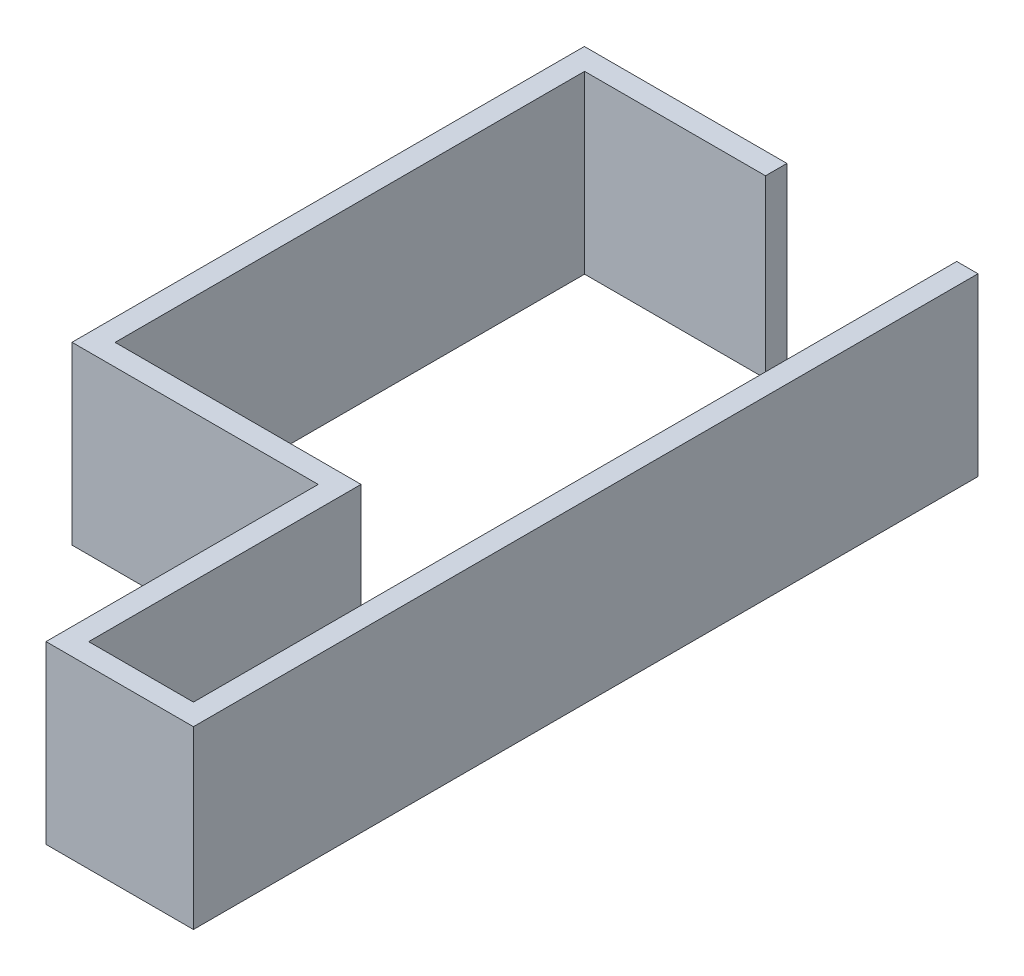
ISO-10303-21;
HEADER;
FILE_DESCRIPTION(('STEP AP214'),'2;1');
FILE_NAME('part.step','',(''),(''),'','','');
FILE_SCHEMA(('AUTOMOTIVE_DESIGN { 1 0 10303 214 1 1 1 1 }'));
ENDSEC;
DATA;
#1=APPLICATION_CONTEXT('core data for automotive mechanical design processes');
#2=APPLICATION_PROTOCOL_DEFINITION('international standard','automotive_design',2000,#1);
#3=PRODUCT_CONTEXT('',#1,'mechanical');
#4=PRODUCT('Part','Part','',(#3));
#5=PRODUCT_RELATED_PRODUCT_CATEGORY('part','',(#4));
#6=PRODUCT_DEFINITION_FORMATION('','',#4);
#7=PRODUCT_DEFINITION_CONTEXT('part definition',#1,'design');
#8=PRODUCT_DEFINITION('design','',#6,#7);
#9=PRODUCT_DEFINITION_SHAPE('','',#8);
#10=(LENGTH_UNIT() NAMED_UNIT(*) SI_UNIT(.MILLI.,.METRE.));
#11=(NAMED_UNIT(*) PLANE_ANGLE_UNIT() SI_UNIT($,.RADIAN.));
#12=(NAMED_UNIT(*) SI_UNIT($,.STERADIAN.) SOLID_ANGLE_UNIT());
#13=UNCERTAINTY_MEASURE_WITH_UNIT(LENGTH_MEASURE(1.E-05),#10,'distance_accuracy_value','');
#14=(GEOMETRIC_REPRESENTATION_CONTEXT(3) GLOBAL_UNCERTAINTY_ASSIGNED_CONTEXT((#13)) GLOBAL_UNIT_ASSIGNED_CONTEXT((#10,
#11,#12)) REPRESENTATION_CONTEXT('',''));
#15=CARTESIAN_POINT('',(0.,0.,0.));
#16=DIRECTION('',(0.,0.,1.));
#17=DIRECTION('',(1.,0.,0.));
#18=AXIS2_PLACEMENT_3D('',#15,#16,#17);
#19=CARTESIAN_POINT('',(4.11116501774704,20.5,0.));
#20=DIRECTION('',(1.,0.,0.));
#21=DIRECTION('',(0.,0.,-1.));
#22=AXIS2_PLACEMENT_3D('',#19,#20,#21);
#23=PLANE('',#22);
#24=DIRECTION('',(0.,0.,1.));
#25=VECTOR('',#24,1.);
#26=CARTESIAN_POINT('',(4.11116501774704,0.,0.));
#27=LINE('',#26,#25);
#28=CARTESIAN_POINT('',(4.111165017747,0.,-29.9));
#29=VERTEX_POINT('',#28);
#30=CARTESIAN_POINT('',(4.111165017747,0.,-27.4));
#31=VERTEX_POINT('',#30);
#32=EDGE_CURVE('E166',#29,#31,#27,.T.);
#33=ORIENTED_EDGE('',*,*,#32,.F.);
#34=DIRECTION('',(0.,-1.,0.));
#35=VECTOR('',#34,1.);
#36=CARTESIAN_POINT('',(4.111165017747,20.5,-29.9));
#37=LINE('',#36,#35);
#38=CARTESIAN_POINT('',(4.111165017747,20.5,-29.9));
#39=VERTEX_POINT('',#38);
#40=EDGE_CURVE('E11',#39,#29,#37,.T.);
#41=ORIENTED_EDGE('',*,*,#40,.F.);
#42=DIRECTION('',(0.,0.,1.));
#43=VECTOR('',#42,1.);
#44=CARTESIAN_POINT('',(4.11116501774704,20.5,0.));
#45=LINE('',#44,#43);
#46=CARTESIAN_POINT('',(4.111165017747,20.5,-27.4));
#47=VERTEX_POINT('',#46);
#48=EDGE_CURVE('E198',#39,#47,#45,.T.);
#49=ORIENTED_EDGE('',*,*,#48,.T.);
#50=DIRECTION('',(0.,-1.,0.));
#51=VECTOR('',#50,1.);
#52=CARTESIAN_POINT('',(4.111165017747,20.5,-27.4));
#53=LINE('',#52,#51);
#54=EDGE_CURVE('E52',#47,#31,#53,.T.);
#55=ORIENTED_EDGE('',*,*,#54,.T.);
#56=EDGE_LOOP('',(#33,#41,#49,#55));
#57=FACE_BOUND('',#56,.T.);
#58=ADVANCED_FACE('F36',(#57),#23,.T.);
#59=CARTESIAN_POINT('',(0.,20.5,-29.9));
#60=DIRECTION('',(0.,0.,1.));
#61=DIRECTION('',(1.,0.,0.));
#62=AXIS2_PLACEMENT_3D('',#59,#60,#61);
#63=PLANE('',#62);
#64=DIRECTION('',(-1.,0.,0.));
#65=VECTOR('',#64,1.);
#66=CARTESIAN_POINT('',(0.,0.,-29.9));
#67=LINE('',#66,#65);
#68=CARTESIAN_POINT('',(-19.5263599150846,0.,-29.9));
#69=VERTEX_POINT('',#68);
#70=EDGE_CURVE('E168',#29,#69,#67,.T.);
#71=ORIENTED_EDGE('',*,*,#70,.T.);
#72=DIRECTION('',(0.,-1.,0.));
#73=VECTOR('',#72,1.);
#74=CARTESIAN_POINT('',(-19.5263599150846,20.5,-29.9));
#75=LINE('',#74,#73);
#76=CARTESIAN_POINT('',(-19.5263599150846,20.5,-29.9));
#77=VERTEX_POINT('',#76);
#78=EDGE_CURVE('E44',#77,#69,#75,.T.);
#79=ORIENTED_EDGE('',*,*,#78,.F.);
#80=DIRECTION('',(-1.,0.,0.));
#81=VECTOR('',#80,1.);
#82=CARTESIAN_POINT('',(0.,20.5,-29.9));
#83=LINE('',#82,#81);
#84=EDGE_CURVE('E438',#39,#77,#83,.T.);
#85=ORIENTED_EDGE('',*,*,#84,.F.);
#86=ORIENTED_EDGE('',*,*,#40,.T.);
#87=EDGE_LOOP('',(#71,#79,#85,#86));
#88=FACE_BOUND('',#87,.T.);
#89=ADVANCED_FACE('F278',(#88),#63,.F.);
#90=CARTESIAN_POINT('',(-19.5263599150846,20.5,0.));
#91=DIRECTION('',(1.,0.,0.));
#92=DIRECTION('',(0.,0.,-1.));
#93=AXIS2_PLACEMENT_3D('',#90,#91,#92);
#94=PLANE('',#93);
#95=DIRECTION('',(0.,0.,1.));
#96=VECTOR('',#95,1.);
#97=CARTESIAN_POINT('',(-19.5263599150846,0.,0.));
#98=LINE('',#97,#96);
#99=CARTESIAN_POINT('',(-19.5263599150846,0.,29.8914715800799));
#100=VERTEX_POINT('',#99);
#101=EDGE_CURVE('E170',#69,#100,#98,.T.);
#102=ORIENTED_EDGE('',*,*,#101,.T.);
#103=DIRECTION('',(0.,-1.,0.));
#104=VECTOR('',#103,1.);
#105=CARTESIAN_POINT('',(-19.5263599150846,20.5,29.8914715800799));
#106=LINE('',#105,#104);
#107=CARTESIAN_POINT('',(-19.5263599150846,20.5,29.8914715800799));
#108=VERTEX_POINT('',#107);
#109=EDGE_CURVE('E220',#108,#100,#106,.T.);
#110=ORIENTED_EDGE('',*,*,#109,.F.);
#111=DIRECTION('',(0.,0.,1.));
#112=VECTOR('',#111,1.);
#113=CARTESIAN_POINT('',(-19.5263599150846,20.5,0.));
#114=LINE('',#113,#112);
#115=EDGE_CURVE('E229',#77,#108,#114,.T.);
#116=ORIENTED_EDGE('',*,*,#115,.F.);
#117=ORIENTED_EDGE('',*,*,#78,.T.);
#118=EDGE_LOOP('',(#102,#110,#116,#117));
#119=FACE_BOUND('',#118,.T.);
#120=ADVANCED_FACE('F227',(#119),#94,.F.);
#121=CARTESIAN_POINT('',(0.,20.5,29.8914715800799));
#122=DIRECTION('',(0.,0.,-1.));
#123=DIRECTION('',(-1.,0.,0.));
#124=AXIS2_PLACEMENT_3D('',#121,#122,#123);
#125=PLANE('',#124);
#126=DIRECTION('',(1.,0.,0.));
#127=VECTOR('',#126,1.);
#128=CARTESIAN_POINT('',(0.,0.,29.8914715800799));
#129=LINE('',#128,#127);
#130=CARTESIAN_POINT('',(9.20528572326132,0.,29.8914715800799));
#131=VERTEX_POINT('',#130);
#132=EDGE_CURVE('E172',#100,#131,#129,.T.);
#133=ORIENTED_EDGE('',*,*,#132,.T.);
#134=DIRECTION('',(0.,-1.,0.));
#135=VECTOR('',#134,1.);
#136=CARTESIAN_POINT('',(9.20528572326132,20.5,29.8914715800799));
#137=LINE('',#136,#135);
#138=CARTESIAN_POINT('',(9.20528572326132,20.5,29.8914715800799));
#139=VERTEX_POINT('',#138);
#140=EDGE_CURVE('E217',#139,#131,#137,.T.);
#141=ORIENTED_EDGE('',*,*,#140,.F.);
#142=DIRECTION('',(1.,0.,0.));
#143=VECTOR('',#142,1.);
#144=CARTESIAN_POINT('',(0.,20.5,29.8914715800799));
#145=LINE('',#144,#143);
#146=EDGE_CURVE('E248',#108,#139,#145,.T.);
#147=ORIENTED_EDGE('',*,*,#146,.F.);
#148=ORIENTED_EDGE('',*,*,#109,.T.);
#149=EDGE_LOOP('',(#133,#141,#147,#148));
#150=FACE_BOUND('',#149,.T.);
#151=ADVANCED_FACE('F239',(#150),#125,.F.);
#152=CARTESIAN_POINT('',(9.20528572326132,20.5,0.));
#153=DIRECTION('',(1.,0.,0.));
#154=DIRECTION('',(0.,0.,-1.));
#155=AXIS2_PLACEMENT_3D('',#152,#153,#154);
#156=PLANE('',#155);
#157=DIRECTION('',(0.,0.,1.));
#158=VECTOR('',#157,1.);
#159=CARTESIAN_POINT('',(9.20528572326132,0.,0.));
#160=LINE('',#159,#158);
#161=CARTESIAN_POINT('',(9.20528572326132,0.,61.6564594464719));
#162=VERTEX_POINT('',#161);
#163=EDGE_CURVE('E174',#131,#162,#160,.T.);
#164=ORIENTED_EDGE('',*,*,#163,.T.);
#165=DIRECTION('',(0.,-1.,0.));
#166=VECTOR('',#165,1.);
#167=CARTESIAN_POINT('',(9.20528572326132,20.5,61.6564594464719));
#168=LINE('',#167,#166);
#169=CARTESIAN_POINT('',(9.20528572326132,20.5,61.6564594464719));
#170=VERTEX_POINT('',#169);
#171=EDGE_CURVE('E214',#170,#162,#168,.T.);
#172=ORIENTED_EDGE('',*,*,#171,.F.);
#173=DIRECTION('',(0.,0.,1.));
#174=VECTOR('',#173,1.);
#175=CARTESIAN_POINT('',(9.20528572326132,20.5,0.));
#176=LINE('',#175,#174);
#177=EDGE_CURVE('E245',#139,#170,#176,.T.);
#178=ORIENTED_EDGE('',*,*,#177,.F.);
#179=ORIENTED_EDGE('',*,*,#140,.T.);
#180=EDGE_LOOP('',(#164,#172,#178,#179));
#181=FACE_BOUND('',#180,.T.);
#182=ADVANCED_FACE('F243',(#181),#156,.F.);
#183=CARTESIAN_POINT('',(0.,20.5,61.6564594464719));
#184=DIRECTION('',(0.,0.,-1.));
#185=DIRECTION('',(-1.,0.,0.));
#186=AXIS2_PLACEMENT_3D('',#183,#184,#185);
#187=PLANE('',#186);
#188=DIRECTION('',(1.,0.,0.));
#189=VECTOR('',#188,1.);
#190=CARTESIAN_POINT('',(0.,0.,61.6564594464719));
#191=LINE('',#190,#189);
#192=CARTESIAN_POINT('',(26.4102292483423,0.,61.6564594464719));
#193=VERTEX_POINT('',#192);
#194=EDGE_CURVE('E176',#162,#193,#191,.T.);
#195=ORIENTED_EDGE('',*,*,#194,.T.);
#196=DIRECTION('',(0.,-1.,0.));
#197=VECTOR('',#196,1.);
#198=CARTESIAN_POINT('',(26.4102292483423,20.5,61.6564594464719));
#199=LINE('',#198,#197);
#200=CARTESIAN_POINT('',(26.4102292483423,20.5,61.6564594464719));
#201=VERTEX_POINT('',#200);
#202=EDGE_CURVE('E211',#201,#193,#199,.T.);
#203=ORIENTED_EDGE('',*,*,#202,.F.);
#204=DIRECTION('',(1.,0.,0.));
#205=VECTOR('',#204,1.);
#206=CARTESIAN_POINT('',(0.,20.5,61.6564594464719));
#207=LINE('',#206,#205);
#208=EDGE_CURVE('E247',#170,#201,#207,.T.);
#209=ORIENTED_EDGE('',*,*,#208,.F.);
#210=ORIENTED_EDGE('',*,*,#171,.T.);
#211=EDGE_LOOP('',(#195,#203,#209,#210));
#212=FACE_BOUND('',#211,.T.);
#213=ADVANCED_FACE('F291',(#212),#187,.F.);
#214=CARTESIAN_POINT('',(26.4102292483423,20.5,0.));
#215=DIRECTION('',(-1.,0.,0.));
#216=DIRECTION('',(0.,0.,1.));
#217=AXIS2_PLACEMENT_3D('',#214,#215,#216);
#218=PLANE('',#217);
#219=DIRECTION('',(0.,0.,-1.));
#220=VECTOR('',#219,1.);
#221=CARTESIAN_POINT('',(26.4102292483423,0.,0.));
#222=LINE('',#221,#220);
#223=CARTESIAN_POINT('',(26.4102292483423,0.,-29.9));
#224=VERTEX_POINT('',#223);
#225=EDGE_CURVE('E178',#193,#224,#222,.T.);
#226=ORIENTED_EDGE('',*,*,#225,.T.);
#227=DIRECTION('',(0.,-1.,0.));
#228=VECTOR('',#227,1.);
#229=CARTESIAN_POINT('',(26.4102292483423,20.5,-29.9));
#230=LINE('',#229,#228);
#231=CARTESIAN_POINT('',(26.4102292483423,20.5,-29.9));
#232=VERTEX_POINT('',#231);
#233=EDGE_CURVE('E208',#232,#224,#230,.T.);
#234=ORIENTED_EDGE('',*,*,#233,.F.);
#235=DIRECTION('',(0.,0.,-1.));
#236=VECTOR('',#235,1.);
#237=CARTESIAN_POINT('',(26.4102292483423,20.5,0.));
#238=LINE('',#237,#236);
#239=EDGE_CURVE('E250',#201,#232,#238,.T.);
#240=ORIENTED_EDGE('',*,*,#239,.F.);
#241=ORIENTED_EDGE('',*,*,#202,.T.);
#242=EDGE_LOOP('',(#226,#234,#240,#241));
#243=FACE_BOUND('',#242,.T.);
#244=ADVANCED_FACE('F294',(#243),#218,.F.);
#245=CARTESIAN_POINT('',(0.,20.5,-29.9));
#246=DIRECTION('',(0.,0.,1.));
#247=DIRECTION('',(1.,0.,0.));
#248=AXIS2_PLACEMENT_3D('',#245,#246,#247);
#249=PLANE('',#248);
#250=DIRECTION('',(-1.,0.,0.));
#251=VECTOR('',#250,1.);
#252=CARTESIAN_POINT('',(0.,0.,-29.9));
#253=LINE('',#252,#251);
#254=CARTESIAN_POINT('',(23.9285830401257,0.,-29.9));
#255=VERTEX_POINT('',#254);
#256=EDGE_CURVE('E180',#224,#255,#253,.T.);
#257=ORIENTED_EDGE('',*,*,#256,.T.);
#258=DIRECTION('',(0.,-1.,0.));
#259=VECTOR('',#258,1.);
#260=CARTESIAN_POINT('',(23.9285830401257,20.5,-29.9));
#261=LINE('',#260,#259);
#262=CARTESIAN_POINT('',(23.9285830401257,20.5,-29.9));
#263=VERTEX_POINT('',#262);
#264=EDGE_CURVE('E206',#263,#255,#261,.T.);
#265=ORIENTED_EDGE('',*,*,#264,.F.);
#266=DIRECTION('',(-1.,0.,0.));
#267=VECTOR('',#266,1.);
#268=CARTESIAN_POINT('',(0.,20.5,-29.9));
#269=LINE('',#268,#267);
#270=EDGE_CURVE('E256',#232,#263,#269,.T.);
#271=ORIENTED_EDGE('',*,*,#270,.F.);
#272=ORIENTED_EDGE('',*,*,#233,.T.);
#273=EDGE_LOOP('',(#257,#265,#271,#272));
#274=FACE_BOUND('',#273,.T.);
#275=ADVANCED_FACE('F298',(#274),#249,.F.);
#276=CARTESIAN_POINT('',(23.9285830401257,20.5,0.));
#277=DIRECTION('',(-1.,0.,0.));
#278=DIRECTION('',(0.,0.,1.));
#279=AXIS2_PLACEMENT_3D('',#276,#277,#278);
#280=PLANE('',#279);
#281=DIRECTION('',(0.,0.,-1.));
#282=VECTOR('',#281,1.);
#283=CARTESIAN_POINT('',(23.9285830401257,0.,0.));
#284=LINE('',#283,#282);
#285=CARTESIAN_POINT('',(23.9285830401257,0.,59.1723908796459));
#286=VERTEX_POINT('',#285);
#287=EDGE_CURVE('E183',#286,#255,#284,.T.);
#288=ORIENTED_EDGE('',*,*,#287,.F.);
#289=DIRECTION('',(0.,-1.,0.));
#290=VECTOR('',#289,1.);
#291=CARTESIAN_POINT('',(23.9285830401257,20.5,59.1723908796459));
#292=LINE('',#291,#290);
#293=CARTESIAN_POINT('',(23.9285830401257,20.5,59.1723908796459));
#294=VERTEX_POINT('',#293);
#295=EDGE_CURVE('E204',#294,#286,#292,.T.);
#296=ORIENTED_EDGE('',*,*,#295,.F.);
#297=DIRECTION('',(0.,0.,-1.));
#298=VECTOR('',#297,1.);
#299=CARTESIAN_POINT('',(23.9285830401257,20.5,0.));
#300=LINE('',#299,#298);
#301=EDGE_CURVE('E258',#294,#263,#300,.T.);
#302=ORIENTED_EDGE('',*,*,#301,.T.);
#303=ORIENTED_EDGE('',*,*,#264,.T.);
#304=EDGE_LOOP('',(#288,#296,#302,#303));
#305=FACE_BOUND('',#304,.T.);
#306=ADVANCED_FACE('F302',(#305),#280,.T.);
#307=CARTESIAN_POINT('',(0.,20.5,59.1723908796459));
#308=DIRECTION('',(0.,0.,-1.));
#309=DIRECTION('',(-1.,0.,0.));
#310=AXIS2_PLACEMENT_3D('',#307,#308,#309);
#311=PLANE('',#310);
#312=DIRECTION('',(1.,0.,0.));
#313=VECTOR('',#312,1.);
#314=CARTESIAN_POINT('',(0.,0.,59.1723908796459));
#315=LINE('',#314,#313);
#316=CARTESIAN_POINT('',(11.7032642309195,0.,59.1723908796459));
#317=VERTEX_POINT('',#316);
#318=EDGE_CURVE('E186',#317,#286,#315,.T.);
#319=ORIENTED_EDGE('',*,*,#318,.F.);
#320=DIRECTION('',(0.,-1.,0.));
#321=VECTOR('',#320,1.);
#322=CARTESIAN_POINT('',(11.7032642309195,20.5,59.1723908796459));
#323=LINE('',#322,#321);
#324=CARTESIAN_POINT('',(11.7032642309195,20.5,59.1723908796459));
#325=VERTEX_POINT('',#324);
#326=EDGE_CURVE('E202',#325,#317,#323,.T.);
#327=ORIENTED_EDGE('',*,*,#326,.F.);
#328=DIRECTION('',(1.,0.,0.));
#329=VECTOR('',#328,1.);
#330=CARTESIAN_POINT('',(0.,20.5,59.1723908796459));
#331=LINE('',#330,#329);
#332=EDGE_CURVE('E261',#325,#294,#331,.T.);
#333=ORIENTED_EDGE('',*,*,#332,.T.);
#334=ORIENTED_EDGE('',*,*,#295,.T.);
#335=EDGE_LOOP('',(#319,#327,#333,#334));
#336=FACE_BOUND('',#335,.T.);
#337=ADVANCED_FACE('F306',(#336),#311,.T.);
#338=CARTESIAN_POINT('',(11.7032642309195,20.5,0.));
#339=DIRECTION('',(1.,0.,0.));
#340=DIRECTION('',(0.,0.,-1.));
#341=AXIS2_PLACEMENT_3D('',#338,#339,#340);
#342=PLANE('',#341);
#343=DIRECTION('',(0.,0.,1.));
#344=VECTOR('',#343,1.);
#345=CARTESIAN_POINT('',(11.7032642309195,0.,0.));
#346=LINE('',#345,#344);
#347=CARTESIAN_POINT('',(11.7032642309195,0.,27.3873694283701));
#348=VERTEX_POINT('',#347);
#349=EDGE_CURVE('E189',#348,#317,#346,.T.);
#350=ORIENTED_EDGE('',*,*,#349,.F.);
#351=DIRECTION('',(0.,-1.,0.));
#352=VECTOR('',#351,1.);
#353=CARTESIAN_POINT('',(11.7032642309195,20.5,27.3873694283701));
#354=LINE('',#353,#352);
#355=CARTESIAN_POINT('',(11.7032642309195,20.5,27.3873694283701));
#356=VERTEX_POINT('',#355);
#357=EDGE_CURVE('E147',#356,#348,#354,.T.);
#358=ORIENTED_EDGE('',*,*,#357,.F.);
#359=DIRECTION('',(0.,0.,1.));
#360=VECTOR('',#359,1.);
#361=CARTESIAN_POINT('',(11.7032642309195,20.5,0.));
#362=LINE('',#361,#360);
#363=EDGE_CURVE('E158',#356,#325,#362,.T.);
#364=ORIENTED_EDGE('',*,*,#363,.T.);
#365=ORIENTED_EDGE('',*,*,#326,.T.);
#366=EDGE_LOOP('',(#350,#358,#364,#365));
#367=FACE_BOUND('',#366,.T.);
#368=ADVANCED_FACE('F265',(#367),#342,.T.);
#369=CARTESIAN_POINT('',(0.,20.5,27.3873694283701));
#370=DIRECTION('',(0.,0.,-1.));
#371=DIRECTION('',(-1.,0.,0.));
#372=AXIS2_PLACEMENT_3D('',#369,#370,#371);
#373=PLANE('',#372);
#374=DIRECTION('',(1.,0.,0.));
#375=VECTOR('',#374,1.);
#376=CARTESIAN_POINT('',(0.,0.,27.3873694283701));
#377=LINE('',#376,#375);
#378=CARTESIAN_POINT('',(-17.,0.,27.3873694283701));
#379=VERTEX_POINT('',#378);
#380=EDGE_CURVE('E143',#379,#348,#377,.T.);
#381=ORIENTED_EDGE('',*,*,#380,.F.);
#382=DIRECTION('',(0.,-1.,0.));
#383=VECTOR('',#382,1.);
#384=CARTESIAN_POINT('',(-17.,20.5,27.3873694283701));
#385=LINE('',#384,#383);
#386=CARTESIAN_POINT('',(-17.,20.5,27.3873694283701));
#387=VERTEX_POINT('',#386);
#388=EDGE_CURVE('E138',#387,#379,#385,.T.);
#389=ORIENTED_EDGE('',*,*,#388,.F.);
#390=DIRECTION('',(1.,0.,0.));
#391=VECTOR('',#390,1.);
#392=CARTESIAN_POINT('',(0.,20.5,27.3873694283701));
#393=LINE('',#392,#391);
#394=EDGE_CURVE('E141',#387,#356,#393,.T.);
#395=ORIENTED_EDGE('',*,*,#394,.T.);
#396=ORIENTED_EDGE('',*,*,#357,.T.);
#397=EDGE_LOOP('',(#381,#389,#395,#396));
#398=FACE_BOUND('',#397,.T.);
#399=ADVANCED_FACE('F140',(#398),#373,.T.);
#400=CARTESIAN_POINT('',(-17.,20.5,0.));
#401=DIRECTION('',(1.,0.,0.));
#402=DIRECTION('',(0.,0.,-1.));
#403=AXIS2_PLACEMENT_3D('',#400,#401,#402);
#404=PLANE('',#403);
#405=DIRECTION('',(0.,0.,1.));
#406=VECTOR('',#405,1.);
#407=CARTESIAN_POINT('',(-17.,0.,0.));
#408=LINE('',#407,#406);
#409=CARTESIAN_POINT('',(-17.,0.,-27.4));
#410=VERTEX_POINT('',#409);
#411=EDGE_CURVE('E193',#410,#379,#408,.T.);
#412=ORIENTED_EDGE('',*,*,#411,.F.);
#413=DIRECTION('',(0.,-1.,0.));
#414=VECTOR('',#413,1.);
#415=CARTESIAN_POINT('',(-17.,20.5,-27.4));
#416=LINE('',#415,#414);
#417=CARTESIAN_POINT('',(-17.,20.5,-27.4));
#418=VERTEX_POINT('',#417);
#419=EDGE_CURVE('E95',#418,#410,#416,.T.);
#420=ORIENTED_EDGE('',*,*,#419,.F.);
#421=DIRECTION('',(0.,0.,1.));
#422=VECTOR('',#421,1.);
#423=CARTESIAN_POINT('',(-17.,20.5,0.));
#424=LINE('',#423,#422);
#425=EDGE_CURVE('E155',#418,#387,#424,.T.);
#426=ORIENTED_EDGE('',*,*,#425,.T.);
#427=ORIENTED_EDGE('',*,*,#388,.T.);
#428=EDGE_LOOP('',(#412,#420,#426,#427));
#429=FACE_BOUND('',#428,.T.);
#430=ADVANCED_FACE('F160',(#429),#404,.T.);
#431=CARTESIAN_POINT('',(0.,20.5,-27.4));
#432=DIRECTION('',(0.,0.,1.));
#433=DIRECTION('',(1.,0.,0.));
#434=AXIS2_PLACEMENT_3D('',#431,#432,#433);
#435=PLANE('',#434);
#436=DIRECTION('',(-1.,0.,0.));
#437=VECTOR('',#436,1.);
#438=CARTESIAN_POINT('',(0.,0.,-27.4));
#439=LINE('',#438,#437);
#440=EDGE_CURVE('E195',#31,#410,#439,.T.);
#441=ORIENTED_EDGE('',*,*,#440,.F.);
#442=ORIENTED_EDGE('',*,*,#54,.F.);
#443=DIRECTION('',(-1.,0.,0.));
#444=VECTOR('',#443,1.);
#445=CARTESIAN_POINT('',(0.,20.5,-27.4));
#446=LINE('',#445,#444);
#447=EDGE_CURVE('E161',#47,#418,#446,.T.);
#448=ORIENTED_EDGE('',*,*,#447,.T.);
#449=ORIENTED_EDGE('',*,*,#419,.T.);
#450=EDGE_LOOP('',(#441,#442,#448,#449));
#451=FACE_BOUND('',#450,.T.);
#452=ADVANCED_FACE('F267',(#451),#435,.T.);
#453=CARTESIAN_POINT('',(0.,20.5,0.));
#454=DIRECTION('',(0.,1.,0.));
#455=DIRECTION('',(0.,0.,1.));
#456=AXIS2_PLACEMENT_3D('',#453,#454,#455);
#457=PLANE('',#456);
#458=ORIENTED_EDGE('',*,*,#48,.F.);
#459=ORIENTED_EDGE('',*,*,#84,.T.);
#460=ORIENTED_EDGE('',*,*,#115,.T.);
#461=ORIENTED_EDGE('',*,*,#146,.T.);
#462=ORIENTED_EDGE('',*,*,#177,.T.);
#463=ORIENTED_EDGE('',*,*,#208,.T.);
#464=ORIENTED_EDGE('',*,*,#239,.T.);
#465=ORIENTED_EDGE('',*,*,#270,.T.);
#466=ORIENTED_EDGE('',*,*,#301,.F.);
#467=ORIENTED_EDGE('',*,*,#332,.F.);
#468=ORIENTED_EDGE('',*,*,#363,.F.);
#469=ORIENTED_EDGE('',*,*,#394,.F.);
#470=ORIENTED_EDGE('',*,*,#425,.F.);
#471=ORIENTED_EDGE('',*,*,#447,.F.);
#472=EDGE_LOOP('',(#458,#459,#460,#461,#462,#463,#464,#465,#466,#467,#468,#469,#470,#471));
#473=FACE_BOUND('',#472,.T.);
#474=ADVANCED_FACE('F153',(#473),#457,.T.);
#475=CARTESIAN_POINT('',(0.,0.,0.));
#476=DIRECTION('',(0.,1.,0.));
#477=DIRECTION('',(0.,0.,1.));
#478=AXIS2_PLACEMENT_3D('',#475,#476,#477);
#479=PLANE('',#478);
#480=ORIENTED_EDGE('',*,*,#32,.T.);
#481=ORIENTED_EDGE('',*,*,#440,.T.);
#482=ORIENTED_EDGE('',*,*,#411,.T.);
#483=ORIENTED_EDGE('',*,*,#380,.T.);
#484=ORIENTED_EDGE('',*,*,#349,.T.);
#485=ORIENTED_EDGE('',*,*,#318,.T.);
#486=ORIENTED_EDGE('',*,*,#287,.T.);
#487=ORIENTED_EDGE('',*,*,#256,.F.);
#488=ORIENTED_EDGE('',*,*,#225,.F.);
#489=ORIENTED_EDGE('',*,*,#194,.F.);
#490=ORIENTED_EDGE('',*,*,#163,.F.);
#491=ORIENTED_EDGE('',*,*,#132,.F.);
#492=ORIENTED_EDGE('',*,*,#101,.F.);
#493=ORIENTED_EDGE('',*,*,#70,.F.);
#494=EDGE_LOOP('',(#480,#481,#482,#483,#484,#485,#486,#487,#488,#489,#490,#491,#492,#493));
#495=FACE_BOUND('',#494,.T.);
#496=ADVANCED_FACE('F234',(#495),#479,.F.);
#497=CLOSED_SHELL('',(#58,#89,#120,#151,#182,#213,#244,#275,#306,#337,#368,#399,#430,#452,#474,#496));
#498=MANIFOLD_SOLID_BREP('B2',#497);
#499=ADVANCED_BREP_SHAPE_REPRESENTATION('',(#18,#498),#14);
#500=SHAPE_DEFINITION_REPRESENTATION(#9,#499);
ENDSEC;
END-ISO-10303-21;
